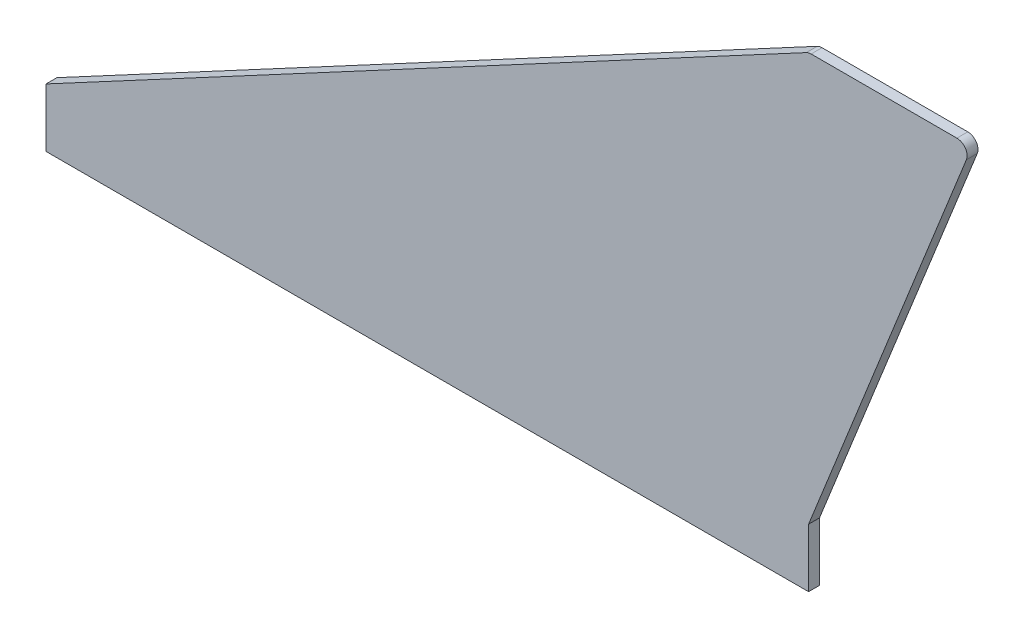
ISO-10303-21;
HEADER;
FILE_DESCRIPTION(('STEP AP214'),'2;1');
FILE_NAME('part.step','',(''),(''),'','','');
FILE_SCHEMA(('AUTOMOTIVE_DESIGN { 1 0 10303 214 1 1 1 1 }'));
ENDSEC;
DATA;
#1=APPLICATION_CONTEXT('core data for automotive mechanical design processes');
#2=APPLICATION_PROTOCOL_DEFINITION('international standard','automotive_design',2000,#1);
#3=PRODUCT_CONTEXT('',#1,'mechanical');
#4=PRODUCT('Part','Part','',(#3));
#5=PRODUCT_RELATED_PRODUCT_CATEGORY('part','',(#4));
#6=PRODUCT_DEFINITION_FORMATION('','',#4);
#7=PRODUCT_DEFINITION_CONTEXT('part definition',#1,'design');
#8=PRODUCT_DEFINITION('design','',#6,#7);
#9=PRODUCT_DEFINITION_SHAPE('','',#8);
#10=(LENGTH_UNIT() NAMED_UNIT(*) SI_UNIT(.MILLI.,.METRE.));
#11=(NAMED_UNIT(*) PLANE_ANGLE_UNIT() SI_UNIT($,.RADIAN.));
#12=(NAMED_UNIT(*) SI_UNIT($,.STERADIAN.) SOLID_ANGLE_UNIT());
#13=UNCERTAINTY_MEASURE_WITH_UNIT(LENGTH_MEASURE(1.E-05),#10,'distance_accuracy_value','');
#14=(GEOMETRIC_REPRESENTATION_CONTEXT(3) GLOBAL_UNCERTAINTY_ASSIGNED_CONTEXT((#13)) GLOBAL_UNIT_ASSIGNED_CONTEXT((#10,
#11,#12)) REPRESENTATION_CONTEXT('',''));
#15=CARTESIAN_POINT('',(0.,0.,0.));
#16=DIRECTION('',(0.,0.,1.));
#17=DIRECTION('',(1.,0.,0.));
#18=AXIS2_PLACEMENT_3D('',#15,#16,#17);
#19=CARTESIAN_POINT('',(0.,-27.2542,5.08));
#20=DIRECTION('',(-1.,0.,0.));
#21=DIRECTION('',(0.,0.,1.));
#22=AXIS2_PLACEMENT_3D('',#19,#20,#21);
#23=PLANE('',#22);
#24=DIRECTION('',(0.,1.,0.));
#25=VECTOR('',#24,1.);
#26=CARTESIAN_POINT('',(0.,-27.2542,0.));
#27=LINE('',#26,#25);
#28=CARTESIAN_POINT('',(0.,-27.2542,0.));
#29=VERTEX_POINT('',#28);
#30=CARTESIAN_POINT('',(0.,0.,0.));
#31=VERTEX_POINT('',#30);
#32=EDGE_CURVE('E156',#29,#31,#27,.T.);
#33=ORIENTED_EDGE('',*,*,#32,.F.);
#34=DIRECTION('',(0.,0.,-1.));
#35=VECTOR('',#34,1.);
#36=CARTESIAN_POINT('',(0.,-27.2542,5.08));
#37=LINE('',#36,#35);
#38=CARTESIAN_POINT('',(0.,-27.2542,5.08));
#39=VERTEX_POINT('',#38);
#40=EDGE_CURVE('E135',#39,#29,#37,.T.);
#41=ORIENTED_EDGE('',*,*,#40,.F.);
#42=DIRECTION('',(0.,1.,0.));
#43=VECTOR('',#42,1.);
#44=CARTESIAN_POINT('',(0.,-27.2542,5.08));
#45=LINE('',#44,#43);
#46=CARTESIAN_POINT('',(0.,0.,5.08));
#47=VERTEX_POINT('',#46);
#48=EDGE_CURVE('E130',#39,#47,#45,.T.);
#49=ORIENTED_EDGE('',*,*,#48,.T.);
#50=DIRECTION('',(0.,0.,-1.));
#51=VECTOR('',#50,1.);
#52=CARTESIAN_POINT('',(0.,0.,5.08));
#53=LINE('',#52,#51);
#54=EDGE_CURVE('E113',#47,#31,#53,.T.);
#55=ORIENTED_EDGE('',*,*,#54,.T.);
#56=EDGE_LOOP('',(#33,#41,#49,#55));
#57=FACE_BOUND('',#56,.T.);
#58=ADVANCED_FACE('F45',(#57),#23,.T.);
#59=CARTESIAN_POINT('',(355.6,-27.2542,5.08));
#60=DIRECTION('',(0.,-1.,0.));
#61=DIRECTION('',(1.,0.,0.));
#62=AXIS2_PLACEMENT_3D('',#59,#60,#61);
#63=PLANE('',#62);
#64=DIRECTION('',(-1.,0.,0.));
#65=VECTOR('',#64,1.);
#66=CARTESIAN_POINT('',(355.6,-27.2542,0.));
#67=LINE('',#66,#65);
#68=CARTESIAN_POINT('',(355.6,-27.2542,0.));
#69=VERTEX_POINT('',#68);
#70=EDGE_CURVE('E137',#69,#29,#67,.T.);
#71=ORIENTED_EDGE('',*,*,#70,.F.);
#72=DIRECTION('',(0.,0.,-1.));
#73=VECTOR('',#72,1.);
#74=CARTESIAN_POINT('',(355.6,-27.2542,5.08));
#75=LINE('',#74,#73);
#76=CARTESIAN_POINT('',(355.6,-27.2542,5.08));
#77=VERTEX_POINT('',#76);
#78=EDGE_CURVE('E174',#77,#69,#75,.T.);
#79=ORIENTED_EDGE('',*,*,#78,.F.);
#80=DIRECTION('',(-1.,0.,0.));
#81=VECTOR('',#80,1.);
#82=CARTESIAN_POINT('',(355.6,-27.2542,5.08));
#83=LINE('',#82,#81);
#84=EDGE_CURVE('E125',#77,#39,#83,.T.);
#85=ORIENTED_EDGE('',*,*,#84,.T.);
#86=ORIENTED_EDGE('',*,*,#40,.T.);
#87=EDGE_LOOP('',(#71,#79,#85,#86));
#88=FACE_BOUND('',#87,.T.);
#89=ADVANCED_FACE('F214',(#88),#63,.T.);
#90=CARTESIAN_POINT('',(355.6,0.,5.08));
#91=DIRECTION('',(1.,0.,0.));
#92=DIRECTION('',(0.,0.,-1.));
#93=AXIS2_PLACEMENT_3D('',#90,#91,#92);
#94=PLANE('',#93);
#95=DIRECTION('',(0.,-1.,0.));
#96=VECTOR('',#95,1.);
#97=CARTESIAN_POINT('',(355.6,0.,0.));
#98=LINE('',#97,#96);
#99=CARTESIAN_POINT('',(355.6,0.,0.));
#100=VERTEX_POINT('',#99);
#101=EDGE_CURVE('E141',#100,#69,#98,.T.);
#102=ORIENTED_EDGE('',*,*,#101,.F.);
#103=DIRECTION('',(0.,0.,-1.));
#104=VECTOR('',#103,1.);
#105=CARTESIAN_POINT('',(355.6,0.,5.08));
#106=LINE('',#105,#104);
#107=CARTESIAN_POINT('',(355.6,0.,5.08));
#108=VERTEX_POINT('',#107);
#109=EDGE_CURVE('E124',#108,#100,#106,.T.);
#110=ORIENTED_EDGE('',*,*,#109,.F.);
#111=DIRECTION('',(0.,-1.,0.));
#112=VECTOR('',#111,1.);
#113=CARTESIAN_POINT('',(355.6,0.,5.08));
#114=LINE('',#113,#112);
#115=EDGE_CURVE('E150',#108,#77,#114,.T.);
#116=ORIENTED_EDGE('',*,*,#115,.T.);
#117=ORIENTED_EDGE('',*,*,#78,.T.);
#118=EDGE_LOOP('',(#102,#110,#116,#117));
#119=FACE_BOUND('',#118,.T.);
#120=ADVANCED_FACE('F211',(#119),#94,.T.);
#121=CARTESIAN_POINT('',(431.8,190.5,5.08));
#122=DIRECTION('',(0.928476690885259,-0.371390676354103,0.));
#123=DIRECTION('',(0.371390676354103,0.92847669088526,0.));
#124=AXIS2_PLACEMENT_3D('',#121,#122,#123);
#125=PLANE('',#124);
#126=DIRECTION('',(-0.371390676354103,-0.928476690885259,0.));
#127=VECTOR('',#126,1.);
#128=CARTESIAN_POINT('',(431.8,190.5,0.));
#129=LINE('',#128,#127);
#130=CARTESIAN_POINT('',(429.187500761545,183.968751903864,0.));
#131=VERTEX_POINT('',#130);
#132=EDGE_CURVE('E165',#131,#100,#129,.T.);
#133=ORIENTED_EDGE('',*,*,#132,.F.);
#134=DIRECTION('',(0.,0.,-1.));
#135=VECTOR('',#134,1.);
#136=CARTESIAN_POINT('',(429.187500761545,183.968751903864,5.08));
#137=LINE('',#136,#135);
#138=CARTESIAN_POINT('',(429.187500761545,183.968751903864,5.08));
#139=VERTEX_POINT('',#138);
#140=EDGE_CURVE('E69',#131,#139,#137,.F.);
#141=ORIENTED_EDGE('',*,*,#140,.T.);
#142=DIRECTION('',(-0.371390676354103,-0.928476690885259,0.));
#143=VECTOR('',#142,1.);
#144=CARTESIAN_POINT('',(431.8,190.5,5.08));
#145=LINE('',#144,#143);
#146=EDGE_CURVE('E147',#139,#108,#145,.T.);
#147=ORIENTED_EDGE('',*,*,#146,.T.);
#148=ORIENTED_EDGE('',*,*,#109,.T.);
#149=EDGE_LOOP('',(#133,#141,#147,#148));
#150=FACE_BOUND('',#149,.T.);
#151=ADVANCED_FACE('F207',(#150),#125,.T.);
#152=CARTESIAN_POINT('',(355.6,190.5,5.08));
#153=DIRECTION('',(0.,1.,0.));
#154=DIRECTION('',(0.,0.,1.));
#155=AXIS2_PLACEMENT_3D('',#152,#153,#154);
#156=PLANE('',#155);
#157=DIRECTION('',(1.,0.,0.));
#158=VECTOR('',#157,1.);
#159=CARTESIAN_POINT('',(355.6,190.5,5.08));
#160=LINE('',#159,#158);
#161=CARTESIAN_POINT('',(356.79531141066,190.5,5.08));
#162=VERTEX_POINT('',#161);
#163=CARTESIAN_POINT('',(424.765630521204,190.5,5.08));
#164=VERTEX_POINT('',#163);
#165=EDGE_CURVE('E133',#162,#164,#160,.T.);
#166=ORIENTED_EDGE('',*,*,#165,.T.);
#167=DIRECTION('',(0.,0.,-1.));
#168=VECTOR('',#167,1.);
#169=CARTESIAN_POINT('',(424.765630521204,190.5,5.08));
#170=LINE('',#169,#168);
#171=CARTESIAN_POINT('',(424.765630521204,190.5,0.));
#172=VERTEX_POINT('',#171);
#173=EDGE_CURVE('E182',#164,#172,#170,.T.);
#174=ORIENTED_EDGE('',*,*,#173,.T.);
#175=DIRECTION('',(1.,0.,0.));
#176=VECTOR('',#175,1.);
#177=CARTESIAN_POINT('',(355.6,190.5,0.));
#178=LINE('',#177,#176);
#179=CARTESIAN_POINT('',(356.79531141066,190.5,0.));
#180=VERTEX_POINT('',#179);
#181=EDGE_CURVE('E161',#180,#172,#178,.T.);
#182=ORIENTED_EDGE('',*,*,#181,.F.);
#183=DIRECTION('',(0.,0.,-1.));
#184=VECTOR('',#183,1.);
#185=CARTESIAN_POINT('',(356.79531141066,190.5,5.08));
#186=LINE('',#185,#184);
#187=EDGE_CURVE('E173',#180,#162,#186,.F.);
#188=ORIENTED_EDGE('',*,*,#187,.T.);
#189=EDGE_LOOP('',(#166,#174,#182,#188));
#190=FACE_BOUND('',#189,.T.);
#191=ADVANCED_FACE('F201',(#190),#156,.T.);
#192=CARTESIAN_POINT('',(0.,0.,5.08));
#193=DIRECTION('',(-0.472221412515419,0.881479970028782,0.));
#194=DIRECTION('',(-0.881479970028782,-0.472221412515419,0.));
#195=AXIS2_PLACEMENT_3D('',#192,#193,#194);
#196=PLANE('',#195);
#197=DIRECTION('',(0.881479970028782,0.472221412515419,0.));
#198=VECTOR('',#197,1.);
#199=CARTESIAN_POINT('',(0.,0.,5.08));
#200=LINE('',#199,#198);
#201=CARTESIAN_POINT('',(354.546356933556,189.935548357262,5.08));
#202=VERTEX_POINT('',#201);
#203=EDGE_CURVE('E115',#47,#202,#200,.T.);
#204=ORIENTED_EDGE('',*,*,#203,.T.);
#205=DIRECTION('',(0.,0.,-1.));
#206=VECTOR('',#205,1.);
#207=CARTESIAN_POINT('',(354.546356933556,189.935548357262,5.08));
#208=LINE('',#207,#206);
#209=CARTESIAN_POINT('',(354.546356933556,189.935548357262,0.));
#210=VERTEX_POINT('',#209);
#211=EDGE_CURVE('E11',#202,#210,#208,.T.);
#212=ORIENTED_EDGE('',*,*,#211,.T.);
#213=DIRECTION('',(0.881479970028782,0.472221412515419,0.));
#214=VECTOR('',#213,1.);
#215=CARTESIAN_POINT('',(0.,0.,0.));
#216=LINE('',#215,#214);
#217=EDGE_CURVE('E118',#31,#210,#216,.T.);
#218=ORIENTED_EDGE('',*,*,#217,.F.);
#219=ORIENTED_EDGE('',*,*,#54,.F.);
#220=EDGE_LOOP('',(#204,#212,#218,#219));
#221=FACE_BOUND('',#220,.T.);
#222=ADVANCED_FACE('F114',(#221),#196,.T.);
#223=CARTESIAN_POINT('',(0.,0.,5.08));
#224=DIRECTION('',(0.,0.,-1.));
#225=DIRECTION('',(-1.,0.,0.));
#226=AXIS2_PLACEMENT_3D('',#223,#224,#225);
#227=PLANE('',#226);
#228=ORIENTED_EDGE('',*,*,#146,.F.);
#229=CARTESIAN_POINT('',(424.765630521204,185.7375,5.08));
#230=DIRECTION('',(0.,0.,-1.));
#231=DIRECTION('',(-1.,0.,0.));
#232=AXIS2_PLACEMENT_3D('',#229,#230,#231);
#233=CIRCLE('',#232,4.7625);
#234=EDGE_CURVE('E54',#139,#164,#233,.F.);
#235=ORIENTED_EDGE('',*,*,#234,.T.);
#236=ORIENTED_EDGE('',*,*,#165,.F.);
#237=CARTESIAN_POINT('',(356.79531141066,185.7375,5.08));
#238=DIRECTION('',(0.,0.,-1.));
#239=DIRECTION('',(-1.,0.,0.));
#240=AXIS2_PLACEMENT_3D('',#237,#238,#239);
#241=CIRCLE('',#240,4.7625);
#242=EDGE_CURVE('E61',#162,#202,#241,.F.);
#243=ORIENTED_EDGE('',*,*,#242,.T.);
#244=ORIENTED_EDGE('',*,*,#203,.F.);
#245=ORIENTED_EDGE('',*,*,#48,.F.);
#246=ORIENTED_EDGE('',*,*,#84,.F.);
#247=ORIENTED_EDGE('',*,*,#115,.F.);
#248=EDGE_LOOP('',(#228,#235,#236,#243,#244,#245,#246,#247));
#249=FACE_BOUND('',#248,.T.);
#250=ADVANCED_FACE('F128',(#249),#227,.F.);
#251=CARTESIAN_POINT('',(0.,0.,0.));
#252=DIRECTION('',(0.,0.,-1.));
#253=DIRECTION('',(-1.,0.,0.));
#254=AXIS2_PLACEMENT_3D('',#251,#252,#253);
#255=PLANE('',#254);
#256=ORIENTED_EDGE('',*,*,#181,.T.);
#257=CARTESIAN_POINT('',(424.765630521204,185.7375,0.));
#258=DIRECTION('',(0.,0.,-1.));
#259=DIRECTION('',(-1.,0.,0.));
#260=AXIS2_PLACEMENT_3D('',#257,#258,#259);
#261=CIRCLE('',#260,4.7625);
#262=EDGE_CURVE('E189',#172,#131,#261,.T.);
#263=ORIENTED_EDGE('',*,*,#262,.T.);
#264=ORIENTED_EDGE('',*,*,#132,.T.);
#265=ORIENTED_EDGE('',*,*,#101,.T.);
#266=ORIENTED_EDGE('',*,*,#70,.T.);
#267=ORIENTED_EDGE('',*,*,#32,.T.);
#268=ORIENTED_EDGE('',*,*,#217,.T.);
#269=CARTESIAN_POINT('',(356.79531141066,185.7375,0.));
#270=DIRECTION('',(0.,0.,-1.));
#271=DIRECTION('',(-1.,0.,0.));
#272=AXIS2_PLACEMENT_3D('',#269,#270,#271);
#273=CIRCLE('',#272,4.7625);
#274=EDGE_CURVE('E186',#210,#180,#273,.T.);
#275=ORIENTED_EDGE('',*,*,#274,.T.);
#276=EDGE_LOOP('',(#256,#263,#264,#265,#266,#267,#268,#275));
#277=FACE_BOUND('',#276,.T.);
#278=ADVANCED_FACE('F206',(#277),#255,.T.);
#279=CARTESIAN_POINT('',(424.765630521204,185.7375,5.08));
#280=DIRECTION('',(0.,0.,-1.));
#281=DIRECTION('',(-1.,0.,0.));
#282=AXIS2_PLACEMENT_3D('',#279,#280,#281);
#283=CYLINDRICAL_SURFACE('',#282,4.7625);
#284=ORIENTED_EDGE('',*,*,#234,.F.);
#285=ORIENTED_EDGE('',*,*,#140,.F.);
#286=ORIENTED_EDGE('',*,*,#262,.F.);
#287=ORIENTED_EDGE('',*,*,#173,.F.);
#288=EDGE_LOOP('',(#284,#285,#286,#287));
#289=FACE_BOUND('',#288,.T.);
#290=ADVANCED_FACE('F204',(#289),#283,.T.);
#291=CARTESIAN_POINT('',(356.79531141066,185.7375,5.08));
#292=DIRECTION('',(0.,0.,-1.));
#293=DIRECTION('',(-1.,0.,0.));
#294=AXIS2_PLACEMENT_3D('',#291,#292,#293);
#295=CYLINDRICAL_SURFACE('',#294,4.7625);
#296=ORIENTED_EDGE('',*,*,#242,.F.);
#297=ORIENTED_EDGE('',*,*,#187,.F.);
#298=ORIENTED_EDGE('',*,*,#274,.F.);
#299=ORIENTED_EDGE('',*,*,#211,.F.);
#300=EDGE_LOOP('',(#296,#297,#298,#299));
#301=FACE_BOUND('',#300,.T.);
#302=ADVANCED_FACE('F47',(#301),#295,.T.);
#303=CLOSED_SHELL('',(#58,#89,#120,#151,#191,#222,#250,#278,#290,#302));
#304=MANIFOLD_SOLID_BREP('B2',#303);
#305=ADVANCED_BREP_SHAPE_REPRESENTATION('',(#18,#304),#14);
#306=SHAPE_DEFINITION_REPRESENTATION(#9,#305);
ENDSEC;
END-ISO-10303-21;
